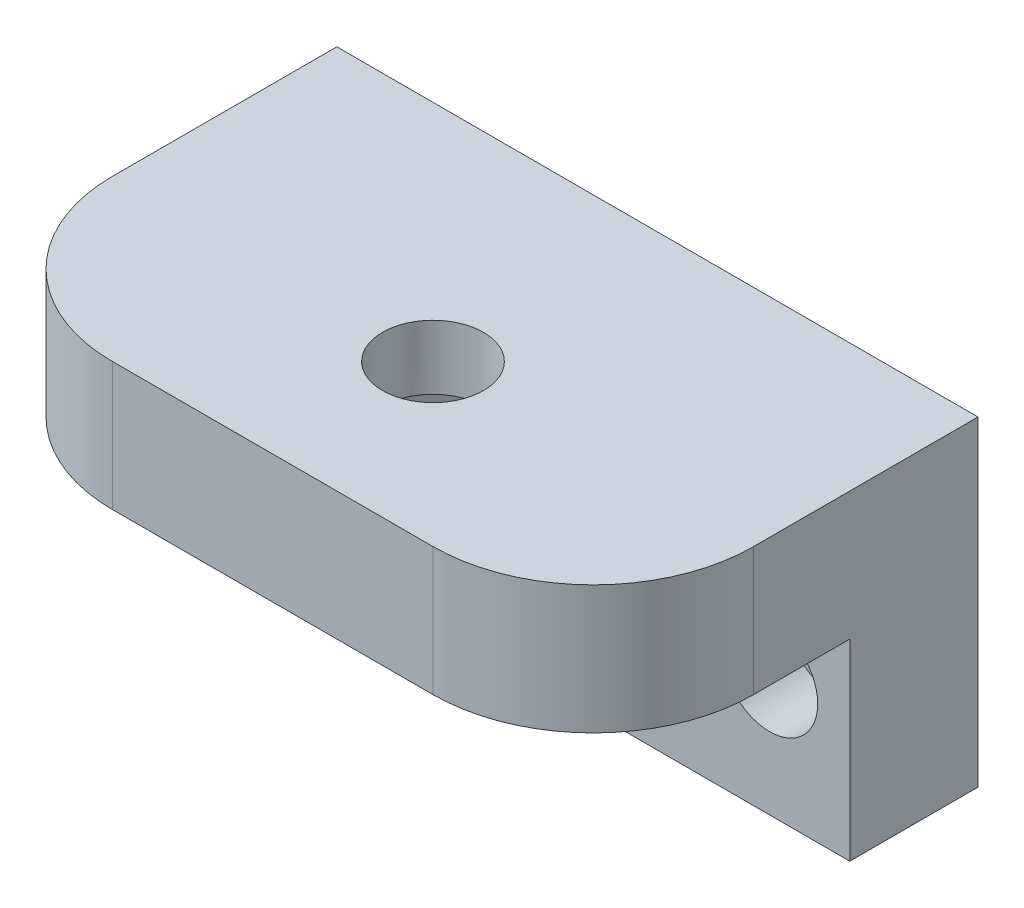
ISO-10303-21;
HEADER;
FILE_DESCRIPTION(('STEP AP214'),'2;1');
FILE_NAME('part.step','',(''),(''),'','','');
FILE_SCHEMA(('AUTOMOTIVE_DESIGN { 1 0 10303 214 1 1 1 1 }'));
ENDSEC;
DATA;
#1=APPLICATION_CONTEXT('core data for automotive mechanical design processes');
#2=APPLICATION_PROTOCOL_DEFINITION('international standard','automotive_design',2000,#1);
#3=PRODUCT_CONTEXT('',#1,'mechanical');
#4=PRODUCT('Part','Part','',(#3));
#5=PRODUCT_RELATED_PRODUCT_CATEGORY('part','',(#4));
#6=PRODUCT_DEFINITION_FORMATION('','',#4);
#7=PRODUCT_DEFINITION_CONTEXT('part definition',#1,'design');
#8=PRODUCT_DEFINITION('design','',#6,#7);
#9=PRODUCT_DEFINITION_SHAPE('','',#8);
#10=(LENGTH_UNIT() NAMED_UNIT(*) SI_UNIT(.MILLI.,.METRE.));
#11=(NAMED_UNIT(*) PLANE_ANGLE_UNIT() SI_UNIT($,.RADIAN.));
#12=(NAMED_UNIT(*) SI_UNIT($,.STERADIAN.) SOLID_ANGLE_UNIT());
#13=UNCERTAINTY_MEASURE_WITH_UNIT(LENGTH_MEASURE(1.E-05),#10,'distance_accuracy_value','');
#14=(GEOMETRIC_REPRESENTATION_CONTEXT(3) GLOBAL_UNCERTAINTY_ASSIGNED_CONTEXT((#13)) GLOBAL_UNIT_ASSIGNED_CONTEXT((#10,
#11,#12)) REPRESENTATION_CONTEXT('',''));
#15=CARTESIAN_POINT('',(0.,0.,0.));
#16=DIRECTION('',(0.,0.,1.));
#17=DIRECTION('',(1.,0.,0.));
#18=AXIS2_PLACEMENT_3D('',#15,#16,#17);
#19=CARTESIAN_POINT('',(0.,-10.,14.));
#20=DIRECTION('',(0.,1.,0.));
#21=DIRECTION('',(0.,0.,1.));
#22=AXIS2_PLACEMENT_3D('',#19,#20,#21);
#23=CYLINDRICAL_SURFACE('',#22,3.15);
#24=CARTESIAN_POINT('',(0.,10.,14.));
#25=DIRECTION('',(0.,1.,0.));
#26=DIRECTION('',(0.,0.,1.));
#27=AXIS2_PLACEMENT_3D('',#24,#25,#26);
#28=CIRCLE('',#27,3.15);
#29=CARTESIAN_POINT('',(0.,10.,17.15));
#30=VERTEX_POINT('',#29);
#31=EDGE_CURVE('E324',#30,#30,#28,.T.);
#32=ORIENTED_EDGE('',*,*,#31,.T.);
#33=EDGE_LOOP('',(#32));
#34=FACE_BOUND('',#33,.T.);
#35=CARTESIAN_POINT('',(0.,6.,14.));
#36=DIRECTION('',(0.,-1.,0.));
#37=DIRECTION('',(0.,0.,-1.));
#38=AXIS2_PLACEMENT_3D('',#35,#36,#37);
#39=CIRCLE('',#38,3.15);
#40=CARTESIAN_POINT('',(0.,6.,10.85));
#41=VERTEX_POINT('',#40);
#42=EDGE_CURVE('E242',#41,#41,#39,.F.);
#43=ORIENTED_EDGE('',*,*,#42,.F.);
#44=EDGE_LOOP('',(#43));
#45=FACE_BOUND('',#44,.T.);
#46=ADVANCED_FACE('F41',(#34,#45),#23,.F.);
#47=CARTESIAN_POINT('',(15.,-2.5,8.));
#48=DIRECTION('',(0.,0.,-1.));
#49=DIRECTION('',(-1.,0.,0.));
#50=AXIS2_PLACEMENT_3D('',#47,#48,#49);
#51=CYLINDRICAL_SURFACE('',#50,1.6);
#52=CARTESIAN_POINT('',(15.,-2.5,0.));
#53=DIRECTION('',(0.,0.,-1.));
#54=DIRECTION('',(-1.,0.,0.));
#55=AXIS2_PLACEMENT_3D('',#52,#53,#54);
#56=CIRCLE('',#55,1.6);
#57=CARTESIAN_POINT('',(13.4,-2.5,0.));
#58=VERTEX_POINT('',#57);
#59=EDGE_CURVE('E321',#58,#58,#56,.T.);
#60=ORIENTED_EDGE('',*,*,#59,.T.);
#61=EDGE_LOOP('',(#60));
#62=FACE_BOUND('',#61,.T.);
#63=CARTESIAN_POINT('',(15.,-2.5,4.));
#64=DIRECTION('',(0.,0.,1.));
#65=DIRECTION('',(1.,0.,0.));
#66=AXIS2_PLACEMENT_3D('',#63,#64,#65);
#67=CIRCLE('',#66,1.6);
#68=CARTESIAN_POINT('',(16.6,-2.5,4.));
#69=VERTEX_POINT('',#68);
#70=EDGE_CURVE('E253',#69,#69,#67,.F.);
#71=ORIENTED_EDGE('',*,*,#70,.F.);
#72=EDGE_LOOP('',(#71));
#73=FACE_BOUND('',#72,.T.);
#74=ADVANCED_FACE('F472',(#62,#73),#51,.F.);
#75=CARTESIAN_POINT('',(-15.,-2.5,8.));
#76=DIRECTION('',(0.,0.,-1.));
#77=DIRECTION('',(-1.,0.,0.));
#78=AXIS2_PLACEMENT_3D('',#75,#76,#77);
#79=CYLINDRICAL_SURFACE('',#78,1.6);
#80=CARTESIAN_POINT('',(-15.,-2.5,0.));
#81=DIRECTION('',(0.,0.,-1.));
#82=DIRECTION('',(-1.,0.,0.));
#83=AXIS2_PLACEMENT_3D('',#80,#81,#82);
#84=CIRCLE('',#83,1.6);
#85=CARTESIAN_POINT('',(-16.6,-2.5,0.));
#86=VERTEX_POINT('',#85);
#87=EDGE_CURVE('E277',#86,#86,#84,.T.);
#88=ORIENTED_EDGE('',*,*,#87,.T.);
#89=EDGE_LOOP('',(#88));
#90=FACE_BOUND('',#89,.T.);
#91=CARTESIAN_POINT('',(-15.,-2.5,4.));
#92=DIRECTION('',(0.,0.,1.));
#93=DIRECTION('',(1.,0.,0.));
#94=AXIS2_PLACEMENT_3D('',#91,#92,#93);
#95=CIRCLE('',#94,1.6);
#96=CARTESIAN_POINT('',(-13.4,-2.5,4.));
#97=VERTEX_POINT('',#96);
#98=EDGE_CURVE('E260',#97,#97,#95,.F.);
#99=ORIENTED_EDGE('',*,*,#98,.F.);
#100=EDGE_LOOP('',(#99));
#101=FACE_BOUND('',#100,.T.);
#102=ADVANCED_FACE('F478',(#90,#101),#79,.F.);
#103=CARTESIAN_POINT('',(0.,0.,0.));
#104=DIRECTION('',(0.,0.,-1.));
#105=DIRECTION('',(-1.,0.,0.));
#106=AXIS2_PLACEMENT_3D('',#103,#104,#105);
#107=PLANE('',#106);
#108=ORIENTED_EDGE('',*,*,#87,.F.);
#109=EDGE_LOOP('',(#108));
#110=FACE_BOUND('',#109,.T.);
#111=ORIENTED_EDGE('',*,*,#59,.F.);
#112=EDGE_LOOP('',(#111));
#113=FACE_BOUND('',#112,.T.);
#114=DIRECTION('',(-1.,0.,0.));
#115=VECTOR('',#114,1.);
#116=CARTESIAN_POINT('',(-7.5,2.5,0.));
#117=LINE('',#116,#115);
#118=CARTESIAN_POINT('',(-7.5,2.5,0.));
#119=VERTEX_POINT('',#118);
#120=CARTESIAN_POINT('',(-11.,2.5,0.));
#121=VERTEX_POINT('',#120);
#122=EDGE_CURVE('E264',#119,#121,#117,.T.);
#123=ORIENTED_EDGE('',*,*,#122,.T.);
#124=DIRECTION('',(0.,-1.,0.));
#125=VECTOR('',#124,1.);
#126=CARTESIAN_POINT('',(-11.,2.5,0.));
#127=LINE('',#126,#125);
#128=CARTESIAN_POINT('',(-11.,-10.,0.));
#129=VERTEX_POINT('',#128);
#130=EDGE_CURVE('E267',#121,#129,#127,.T.);
#131=ORIENTED_EDGE('',*,*,#130,.T.);
#132=DIRECTION('',(1.,0.,0.));
#133=VECTOR('',#132,1.);
#134=CARTESIAN_POINT('',(-20.,-10.,0.));
#135=LINE('',#134,#133);
#136=CARTESIAN_POINT('',(-20.,-10.,0.));
#137=VERTEX_POINT('',#136);
#138=EDGE_CURVE('E345',#137,#129,#135,.T.);
#139=ORIENTED_EDGE('',*,*,#138,.F.);
#140=DIRECTION('',(0.,-1.,0.));
#141=VECTOR('',#140,1.);
#142=CARTESIAN_POINT('',(-20.,-10.,0.));
#143=LINE('',#142,#141);
#144=CARTESIAN_POINT('',(-20.,10.,0.));
#145=VERTEX_POINT('',#144);
#146=EDGE_CURVE('E355',#145,#137,#143,.T.);
#147=ORIENTED_EDGE('',*,*,#146,.F.);
#148=DIRECTION('',(-1.,0.,0.));
#149=VECTOR('',#148,1.);
#150=CARTESIAN_POINT('',(-20.,10.,0.));
#151=LINE('',#150,#149);
#152=CARTESIAN_POINT('',(20.,10.,0.));
#153=VERTEX_POINT('',#152);
#154=EDGE_CURVE('E352',#153,#145,#151,.T.);
#155=ORIENTED_EDGE('',*,*,#154,.F.);
#156=DIRECTION('',(0.,1.,0.));
#157=VECTOR('',#156,1.);
#158=CARTESIAN_POINT('',(20.,-10.,0.));
#159=LINE('',#158,#157);
#160=CARTESIAN_POINT('',(20.,-10.,0.));
#161=VERTEX_POINT('',#160);
#162=EDGE_CURVE('E340',#161,#153,#159,.T.);
#163=ORIENTED_EDGE('',*,*,#162,.F.);
#164=CARTESIAN_POINT('',(11.,-10.,0.));
#165=VERTEX_POINT('',#164);
#166=EDGE_CURVE('E357',#165,#161,#135,.T.);
#167=ORIENTED_EDGE('',*,*,#166,.F.);
#168=DIRECTION('',(0.,1.,0.));
#169=VECTOR('',#168,1.);
#170=CARTESIAN_POINT('',(11.,-10.,0.));
#171=LINE('',#170,#169);
#172=CARTESIAN_POINT('',(11.,2.5,0.));
#173=VERTEX_POINT('',#172);
#174=EDGE_CURVE('E275',#165,#173,#171,.T.);
#175=ORIENTED_EDGE('',*,*,#174,.T.);
#176=DIRECTION('',(-1.,0.,0.));
#177=VECTOR('',#176,1.);
#178=CARTESIAN_POINT('',(11.,2.5,0.));
#179=LINE('',#178,#177);
#180=CARTESIAN_POINT('',(7.5,2.5,0.));
#181=VERTEX_POINT('',#180);
#182=EDGE_CURVE('E273',#173,#181,#179,.T.);
#183=ORIENTED_EDGE('',*,*,#182,.T.);
#184=DIRECTION('',(0.,1.,0.));
#185=VECTOR('',#184,1.);
#186=CARTESIAN_POINT('',(7.5,2.5,0.));
#187=LINE('',#186,#185);
#188=CARTESIAN_POINT('',(7.5,6.5,0.));
#189=VERTEX_POINT('',#188);
#190=EDGE_CURVE('E271',#181,#189,#187,.T.);
#191=ORIENTED_EDGE('',*,*,#190,.T.);
#192=DIRECTION('',(-1.,0.,0.));
#193=VECTOR('',#192,1.);
#194=CARTESIAN_POINT('',(7.5,6.5,0.));
#195=LINE('',#194,#193);
#196=CARTESIAN_POINT('',(-7.5,6.5,0.));
#197=VERTEX_POINT('',#196);
#198=EDGE_CURVE('E269',#189,#197,#195,.T.);
#199=ORIENTED_EDGE('',*,*,#198,.T.);
#200=DIRECTION('',(0.,-1.,0.));
#201=VECTOR('',#200,1.);
#202=CARTESIAN_POINT('',(-7.5,6.5,0.));
#203=LINE('',#202,#201);
#204=EDGE_CURVE('E266',#197,#119,#203,.T.);
#205=ORIENTED_EDGE('',*,*,#204,.T.);
#206=EDGE_LOOP('',(#123,#131,#139,#147,#155,#163,#167,#175,#183,#191,#199,#205));
#207=FACE_BOUND('',#206,.T.);
#208=ADVANCED_FACE('F404',(#110,#113,#207),#107,.T.);
#209=CARTESIAN_POINT('',(0.,0.,8.));
#210=DIRECTION('',(0.,0.,-1.));
#211=DIRECTION('',(-1.,0.,0.));
#212=AXIS2_PLACEMENT_3D('',#209,#210,#211);
#213=PLANE('',#212);
#214=CARTESIAN_POINT('',(15.,-2.5,8.));
#215=DIRECTION('',(0.,0.,1.));
#216=DIRECTION('',(1.,0.,0.));
#217=AXIS2_PLACEMENT_3D('',#214,#215,#216);
#218=CIRCLE('',#217,3.);
#219=CARTESIAN_POINT('',(18.,-2.5,8.));
#220=VERTEX_POINT('',#219);
#221=EDGE_CURVE('E254',#220,#220,#218,.T.);
#222=ORIENTED_EDGE('',*,*,#221,.F.);
#223=EDGE_LOOP('',(#222));
#224=FACE_BOUND('',#223,.T.);
#225=CARTESIAN_POINT('',(-15.,-2.5,8.));
#226=DIRECTION('',(0.,0.,1.));
#227=DIRECTION('',(1.,0.,0.));
#228=AXIS2_PLACEMENT_3D('',#225,#226,#227);
#229=CIRCLE('',#228,3.);
#230=CARTESIAN_POINT('',(-12.,-2.5,8.));
#231=VERTEX_POINT('',#230);
#232=EDGE_CURVE('E261',#231,#231,#229,.T.);
#233=ORIENTED_EDGE('',*,*,#232,.F.);
#234=EDGE_LOOP('',(#233));
#235=FACE_BOUND('',#234,.T.);
#236=DIRECTION('',(1.,0.,0.));
#237=VECTOR('',#236,1.);
#238=CARTESIAN_POINT('',(-20.,2.,8.));
#239=LINE('',#238,#237);
#240=CARTESIAN_POINT('',(-20.,2.,8.));
#241=VERTEX_POINT('',#240);
#242=CARTESIAN_POINT('',(20.,2.,8.));
#243=VERTEX_POINT('',#242);
#244=EDGE_CURVE('E327',#241,#243,#239,.T.);
#245=ORIENTED_EDGE('',*,*,#244,.F.);
#246=DIRECTION('',(0.,-1.,0.));
#247=VECTOR('',#246,1.);
#248=CARTESIAN_POINT('',(-20.,-10.,8.));
#249=LINE('',#248,#247);
#250=CARTESIAN_POINT('',(-20.,-10.,8.));
#251=VERTEX_POINT('',#250);
#252=EDGE_CURVE('E344',#241,#251,#249,.T.);
#253=ORIENTED_EDGE('',*,*,#252,.T.);
#254=DIRECTION('',(1.,0.,0.));
#255=VECTOR('',#254,1.);
#256=CARTESIAN_POINT('',(-20.,-10.,8.));
#257=LINE('',#256,#255);
#258=CARTESIAN_POINT('',(20.,-10.,8.));
#259=VERTEX_POINT('',#258);
#260=EDGE_CURVE('E347',#251,#259,#257,.T.);
#261=ORIENTED_EDGE('',*,*,#260,.T.);
#262=DIRECTION('',(0.,1.,0.));
#263=VECTOR('',#262,1.);
#264=CARTESIAN_POINT('',(20.,-10.,8.));
#265=LINE('',#264,#263);
#266=EDGE_CURVE('E341',#259,#243,#265,.T.);
#267=ORIENTED_EDGE('',*,*,#266,.T.);
#268=EDGE_LOOP('',(#245,#253,#261,#267));
#269=FACE_BOUND('',#268,.T.);
#270=ADVANCED_FACE('F418',(#224,#235,#269),#213,.F.);
#271=CARTESIAN_POINT('',(20.,-10.,8.));
#272=DIRECTION('',(-1.,0.,0.));
#273=DIRECTION('',(0.,0.,1.));
#274=AXIS2_PLACEMENT_3D('',#271,#272,#273);
#275=PLANE('',#274);
#276=DIRECTION('',(0.,0.,-1.));
#277=VECTOR('',#276,1.);
#278=CARTESIAN_POINT('',(20.,10.,8.));
#279=LINE('',#278,#277);
#280=CARTESIAN_POINT('',(20.,10.,14.));
#281=VERTEX_POINT('',#280);
#282=EDGE_CURVE('E367',#281,#153,#279,.T.);
#283=ORIENTED_EDGE('',*,*,#282,.F.);
#284=DIRECTION('',(0.,1.,0.));
#285=VECTOR('',#284,1.);
#286=CARTESIAN_POINT('',(20.,2.,14.));
#287=LINE('',#286,#285);
#288=CARTESIAN_POINT('',(20.,2.,14.));
#289=VERTEX_POINT('',#288);
#290=EDGE_CURVE('E64',#281,#289,#287,.F.);
#291=ORIENTED_EDGE('',*,*,#290,.T.);
#292=DIRECTION('',(0.,0.,-1.));
#293=VECTOR('',#292,1.);
#294=CARTESIAN_POINT('',(20.,2.,24.));
#295=LINE('',#294,#293);
#296=EDGE_CURVE('E334',#289,#243,#295,.T.);
#297=ORIENTED_EDGE('',*,*,#296,.T.);
#298=ORIENTED_EDGE('',*,*,#266,.F.);
#299=DIRECTION('',(0.,0.,-1.));
#300=VECTOR('',#299,1.);
#301=CARTESIAN_POINT('',(20.,-10.,8.));
#302=LINE('',#301,#300);
#303=EDGE_CURVE('E349',#259,#161,#302,.T.);
#304=ORIENTED_EDGE('',*,*,#303,.T.);
#305=ORIENTED_EDGE('',*,*,#162,.T.);
#306=EDGE_LOOP('',(#283,#291,#297,#298,#304,#305));
#307=FACE_BOUND('',#306,.T.);
#308=ADVANCED_FACE('F398',(#307),#275,.F.);
#309=CARTESIAN_POINT('',(-20.,10.,8.));
#310=DIRECTION('',(0.,-1.,0.));
#311=DIRECTION('',(0.,0.,-1.));
#312=AXIS2_PLACEMENT_3D('',#309,#310,#311);
#313=PLANE('',#312);
#314=ORIENTED_EDGE('',*,*,#31,.F.);
#315=EDGE_LOOP('',(#314));
#316=FACE_BOUND('',#315,.T.);
#317=DIRECTION('',(-1.,0.,0.));
#318=VECTOR('',#317,1.);
#319=CARTESIAN_POINT('',(-20.,10.,24.));
#320=LINE('',#319,#318);
#321=CARTESIAN_POINT('',(9.99999999999999,10.,24.));
#322=VERTEX_POINT('',#321);
#323=CARTESIAN_POINT('',(-10.,10.,24.));
#324=VERTEX_POINT('',#323);
#325=EDGE_CURVE('E331',#322,#324,#320,.T.);
#326=ORIENTED_EDGE('',*,*,#325,.F.);
#327=CARTESIAN_POINT('',(9.99999999999999,10.,14.));
#328=DIRECTION('',(0.,-1.,0.));
#329=DIRECTION('',(0.,0.,-1.));
#330=AXIS2_PLACEMENT_3D('',#327,#328,#329);
#331=CIRCLE('',#330,10.);
#332=EDGE_CURVE('E383',#322,#281,#331,.F.);
#333=ORIENTED_EDGE('',*,*,#332,.T.);
#334=ORIENTED_EDGE('',*,*,#282,.T.);
#335=ORIENTED_EDGE('',*,*,#154,.T.);
#336=DIRECTION('',(0.,0.,-1.));
#337=VECTOR('',#336,1.);
#338=CARTESIAN_POINT('',(-20.,10.,8.));
#339=LINE('',#338,#337);
#340=CARTESIAN_POINT('',(-20.,10.,14.));
#341=VERTEX_POINT('',#340);
#342=EDGE_CURVE('E365',#341,#145,#339,.T.);
#343=ORIENTED_EDGE('',*,*,#342,.F.);
#344=CARTESIAN_POINT('',(-10.,10.,14.));
#345=DIRECTION('',(0.,-1.,0.));
#346=DIRECTION('',(0.,0.,-1.));
#347=AXIS2_PLACEMENT_3D('',#344,#345,#346);
#348=CIRCLE('',#347,10.);
#349=EDGE_CURVE('E381',#341,#324,#348,.F.);
#350=ORIENTED_EDGE('',*,*,#349,.T.);
#351=EDGE_LOOP('',(#326,#333,#334,#335,#343,#350));
#352=FACE_BOUND('',#351,.T.);
#353=ADVANCED_FACE('F396',(#316,#352),#313,.F.);
#354=CARTESIAN_POINT('',(-20.,-10.,8.));
#355=DIRECTION('',(1.,0.,0.));
#356=DIRECTION('',(0.,0.,-1.));
#357=AXIS2_PLACEMENT_3D('',#354,#355,#356);
#358=PLANE('',#357);
#359=DIRECTION('',(0.,0.,-1.));
#360=VECTOR('',#359,1.);
#361=CARTESIAN_POINT('',(-20.,2.,24.));
#362=LINE('',#361,#360);
#363=CARTESIAN_POINT('',(-20.,2.,14.));
#364=VERTEX_POINT('',#363);
#365=EDGE_CURVE('E338',#364,#241,#362,.T.);
#366=ORIENTED_EDGE('',*,*,#365,.F.);
#367=DIRECTION('',(0.,-1.,0.));
#368=VECTOR('',#367,1.);
#369=CARTESIAN_POINT('',(-20.,10.,14.));
#370=LINE('',#369,#368);
#371=EDGE_CURVE('E11',#364,#341,#370,.F.);
#372=ORIENTED_EDGE('',*,*,#371,.T.);
#373=ORIENTED_EDGE('',*,*,#342,.T.);
#374=ORIENTED_EDGE('',*,*,#146,.T.);
#375=DIRECTION('',(0.,0.,-1.));
#376=VECTOR('',#375,1.);
#377=CARTESIAN_POINT('',(-20.,-10.,8.));
#378=LINE('',#377,#376);
#379=EDGE_CURVE('E362',#251,#137,#378,.T.);
#380=ORIENTED_EDGE('',*,*,#379,.F.);
#381=ORIENTED_EDGE('',*,*,#252,.F.);
#382=EDGE_LOOP('',(#366,#372,#373,#374,#380,#381));
#383=FACE_BOUND('',#382,.T.);
#384=ADVANCED_FACE('F413',(#383),#358,.F.);
#385=CARTESIAN_POINT('',(-20.,-10.,8.));
#386=DIRECTION('',(0.,1.,0.));
#387=DIRECTION('',(0.,0.,1.));
#388=AXIS2_PLACEMENT_3D('',#385,#386,#387);
#389=PLANE('',#388);
#390=ORIENTED_EDGE('',*,*,#138,.T.);
#391=DIRECTION('',(0.,0.,1.));
#392=VECTOR('',#391,1.);
#393=CARTESIAN_POINT('',(-11.,-10.,-73.4428877022476));
#394=LINE('',#393,#392);
#395=CARTESIAN_POINT('',(-11.,-10.,1.6));
#396=VERTEX_POINT('',#395);
#397=EDGE_CURVE('E312',#129,#396,#394,.T.);
#398=ORIENTED_EDGE('',*,*,#397,.T.);
#399=DIRECTION('',(1.,0.,0.));
#400=VECTOR('',#399,1.);
#401=CARTESIAN_POINT('',(-20.,-10.,1.6));
#402=LINE('',#401,#400);
#403=CARTESIAN_POINT('',(11.,-10.,1.6));
#404=VERTEX_POINT('',#403);
#405=EDGE_CURVE('E281',#396,#404,#402,.T.);
#406=ORIENTED_EDGE('',*,*,#405,.T.);
#407=DIRECTION('',(0.,0.,1.));
#408=VECTOR('',#407,1.);
#409=CARTESIAN_POINT('',(11.,-10.,-73.4428877022476));
#410=LINE('',#409,#408);
#411=EDGE_CURVE('E294',#165,#404,#410,.T.);
#412=ORIENTED_EDGE('',*,*,#411,.F.);
#413=ORIENTED_EDGE('',*,*,#166,.T.);
#414=ORIENTED_EDGE('',*,*,#303,.F.);
#415=ORIENTED_EDGE('',*,*,#260,.F.);
#416=ORIENTED_EDGE('',*,*,#379,.T.);
#417=EDGE_LOOP('',(#390,#398,#406,#412,#413,#414,#415,#416));
#418=FACE_BOUND('',#417,.T.);
#419=ADVANCED_FACE('F421',(#418),#389,.F.);
#420=CARTESIAN_POINT('',(-20.,2.,24.));
#421=DIRECTION('',(0.,1.,0.));
#422=DIRECTION('',(0.,0.,1.));
#423=AXIS2_PLACEMENT_3D('',#420,#421,#422);
#424=PLANE('',#423);
#425=DIRECTION('',(-0.5,0.,0.866025403784439));
#426=VECTOR('',#425,1.);
#427=CARTESIAN_POINT('',(6.06217782649107,2.,14.));
#428=LINE('',#427,#426);
#429=CARTESIAN_POINT('',(6.06217782649107,2.,14.));
#430=VERTEX_POINT('',#429);
#431=CARTESIAN_POINT('',(3.03108891324553,2.,19.25));
#432=VERTEX_POINT('',#431);
#433=EDGE_CURVE('E230',#430,#432,#428,.T.);
#434=ORIENTED_EDGE('',*,*,#433,.F.);
#435=DIRECTION('',(0.5,0.,0.866025403784438));
#436=VECTOR('',#435,1.);
#437=CARTESIAN_POINT('',(3.03108891324553,2.,8.75));
#438=LINE('',#437,#436);
#439=CARTESIAN_POINT('',(3.03108891324553,2.,8.75));
#440=VERTEX_POINT('',#439);
#441=EDGE_CURVE('E197',#440,#430,#438,.T.);
#442=ORIENTED_EDGE('',*,*,#441,.F.);
#443=DIRECTION('',(1.,0.,0.));
#444=VECTOR('',#443,1.);
#445=CARTESIAN_POINT('',(-3.03108891324553,2.,8.75));
#446=LINE('',#445,#444);
#447=CARTESIAN_POINT('',(-3.03108891324553,2.,8.75));
#448=VERTEX_POINT('',#447);
#449=EDGE_CURVE('E216',#448,#440,#446,.T.);
#450=ORIENTED_EDGE('',*,*,#449,.F.);
#451=DIRECTION('',(0.5,0.,-0.866025403784439));
#452=VECTOR('',#451,1.);
#453=CARTESIAN_POINT('',(-6.06217782649107,2.,14.));
#454=LINE('',#453,#452);
#455=CARTESIAN_POINT('',(-6.06217782649107,2.,14.));
#456=VERTEX_POINT('',#455);
#457=EDGE_CURVE('E219',#456,#448,#454,.T.);
#458=ORIENTED_EDGE('',*,*,#457,.F.);
#459=DIRECTION('',(-0.5,0.,-0.866025403784439));
#460=VECTOR('',#459,1.);
#461=CARTESIAN_POINT('',(-3.03108891324553,2.,19.25));
#462=LINE('',#461,#460);
#463=CARTESIAN_POINT('',(-3.03108891324553,2.,19.25));
#464=VERTEX_POINT('',#463);
#465=EDGE_CURVE('E235',#464,#456,#462,.T.);
#466=ORIENTED_EDGE('',*,*,#465,.F.);
#467=DIRECTION('',(-1.,0.,0.));
#468=VECTOR('',#467,1.);
#469=CARTESIAN_POINT('',(3.03108891324553,2.,19.25));
#470=LINE('',#469,#468);
#471=EDGE_CURVE('E232',#432,#464,#470,.T.);
#472=ORIENTED_EDGE('',*,*,#471,.F.);
#473=EDGE_LOOP('',(#434,#442,#450,#458,#466,#472));
#474=FACE_BOUND('',#473,.T.);
#475=ORIENTED_EDGE('',*,*,#296,.F.);
#476=CARTESIAN_POINT('',(9.99999999999999,2.,14.));
#477=DIRECTION('',(0.,1.,0.));
#478=DIRECTION('',(0.,0.,1.));
#479=AXIS2_PLACEMENT_3D('',#476,#477,#478);
#480=CIRCLE('',#479,10.);
#481=CARTESIAN_POINT('',(9.99999999999999,2.,24.));
#482=VERTEX_POINT('',#481);
#483=EDGE_CURVE('E49',#289,#482,#480,.F.);
#484=ORIENTED_EDGE('',*,*,#483,.T.);
#485=DIRECTION('',(1.,0.,0.));
#486=VECTOR('',#485,1.);
#487=CARTESIAN_POINT('',(-20.,2.,24.));
#488=LINE('',#487,#486);
#489=CARTESIAN_POINT('',(-10.,2.,24.));
#490=VERTEX_POINT('',#489);
#491=EDGE_CURVE('E328',#490,#482,#488,.T.);
#492=ORIENTED_EDGE('',*,*,#491,.F.);
#493=CARTESIAN_POINT('',(-10.,2.,14.));
#494=DIRECTION('',(0.,1.,0.));
#495=DIRECTION('',(0.,0.,1.));
#496=AXIS2_PLACEMENT_3D('',#493,#494,#495);
#497=CIRCLE('',#496,10.);
#498=EDGE_CURVE('E56',#490,#364,#497,.F.);
#499=ORIENTED_EDGE('',*,*,#498,.T.);
#500=ORIENTED_EDGE('',*,*,#365,.T.);
#501=ORIENTED_EDGE('',*,*,#244,.T.);
#502=EDGE_LOOP('',(#475,#484,#492,#499,#500,#501));
#503=FACE_BOUND('',#502,.T.);
#504=ADVANCED_FACE('F387',(#474,#503),#424,.F.);
#505=CARTESIAN_POINT('',(0.,0.,24.));
#506=DIRECTION('',(0.,0.,1.));
#507=DIRECTION('',(1.,0.,0.));
#508=AXIS2_PLACEMENT_3D('',#505,#506,#507);
#509=PLANE('',#508);
#510=ORIENTED_EDGE('',*,*,#491,.T.);
#511=DIRECTION('',(0.,1.,0.));
#512=VECTOR('',#511,1.);
#513=CARTESIAN_POINT('',(9.99999999999999,10.,24.));
#514=LINE('',#513,#512);
#515=EDGE_CURVE('E378',#482,#322,#514,.T.);
#516=ORIENTED_EDGE('',*,*,#515,.T.);
#517=ORIENTED_EDGE('',*,*,#325,.T.);
#518=DIRECTION('',(0.,-1.,0.));
#519=VECTOR('',#518,1.);
#520=CARTESIAN_POINT('',(-10.,2.,24.));
#521=LINE('',#520,#519);
#522=EDGE_CURVE('E369',#324,#490,#521,.T.);
#523=ORIENTED_EDGE('',*,*,#522,.T.);
#524=EDGE_LOOP('',(#510,#516,#517,#523));
#525=FACE_BOUND('',#524,.T.);
#526=ADVANCED_FACE('F391',(#525),#509,.T.);
#527=CARTESIAN_POINT('',(-11.,2.5,-73.4428877022476));
#528=DIRECTION('',(-1.,0.,0.));
#529=DIRECTION('',(0.,-1.,0.));
#530=AXIS2_PLACEMENT_3D('',#527,#528,#529);
#531=PLANE('',#530);
#532=DIRECTION('',(0.,0.,1.));
#533=VECTOR('',#532,1.);
#534=CARTESIAN_POINT('',(-11.,2.5,-73.4428877022476));
#535=LINE('',#534,#533);
#536=CARTESIAN_POINT('',(-11.,2.5,1.6));
#537=VERTEX_POINT('',#536);
#538=EDGE_CURVE('E314',#121,#537,#535,.T.);
#539=ORIENTED_EDGE('',*,*,#538,.T.);
#540=DIRECTION('',(0.,-1.,0.));
#541=VECTOR('',#540,1.);
#542=CARTESIAN_POINT('',(-11.,2.5,1.6));
#543=LINE('',#542,#541);
#544=EDGE_CURVE('E291',#537,#396,#543,.T.);
#545=ORIENTED_EDGE('',*,*,#544,.T.);
#546=ORIENTED_EDGE('',*,*,#397,.F.);
#547=ORIENTED_EDGE('',*,*,#130,.F.);
#548=EDGE_LOOP('',(#539,#545,#546,#547));
#549=FACE_BOUND('',#548,.T.);
#550=ADVANCED_FACE('F455',(#549),#531,.F.);
#551=CARTESIAN_POINT('',(-7.5,2.5,-73.4428877022476));
#552=DIRECTION('',(0.,1.,0.));
#553=DIRECTION('',(0.,0.,1.));
#554=AXIS2_PLACEMENT_3D('',#551,#552,#553);
#555=PLANE('',#554);
#556=DIRECTION('',(0.,0.,1.));
#557=VECTOR('',#556,1.);
#558=CARTESIAN_POINT('',(-7.5,2.5,-73.4428877022476));
#559=LINE('',#558,#557);
#560=CARTESIAN_POINT('',(-7.5,2.5,1.6));
#561=VERTEX_POINT('',#560);
#562=EDGE_CURVE('E309',#119,#561,#559,.T.);
#563=ORIENTED_EDGE('',*,*,#562,.T.);
#564=DIRECTION('',(-1.,0.,0.));
#565=VECTOR('',#564,1.);
#566=CARTESIAN_POINT('',(-7.5,2.5,1.6));
#567=LINE('',#566,#565);
#568=EDGE_CURVE('E289',#561,#537,#567,.T.);
#569=ORIENTED_EDGE('',*,*,#568,.T.);
#570=ORIENTED_EDGE('',*,*,#538,.F.);
#571=ORIENTED_EDGE('',*,*,#122,.F.);
#572=EDGE_LOOP('',(#563,#569,#570,#571));
#573=FACE_BOUND('',#572,.T.);
#574=ADVANCED_FACE('F452',(#573),#555,.F.);
#575=CARTESIAN_POINT('',(-7.5,6.5,-73.4428877022476));
#576=DIRECTION('',(-1.,0.,0.));
#577=DIRECTION('',(0.,-1.,0.));
#578=AXIS2_PLACEMENT_3D('',#575,#576,#577);
#579=PLANE('',#578);
#580=DIRECTION('',(0.,0.,1.));
#581=VECTOR('',#580,1.);
#582=CARTESIAN_POINT('',(-7.5,6.5,-73.4428877022476));
#583=LINE('',#582,#581);
#584=CARTESIAN_POINT('',(-7.5,6.5,1.6));
#585=VERTEX_POINT('',#584);
#586=EDGE_CURVE('E306',#197,#585,#583,.T.);
#587=ORIENTED_EDGE('',*,*,#586,.T.);
#588=DIRECTION('',(0.,-1.,0.));
#589=VECTOR('',#588,1.);
#590=CARTESIAN_POINT('',(-7.5,6.5,1.6));
#591=LINE('',#590,#589);
#592=EDGE_CURVE('E287',#585,#561,#591,.T.);
#593=ORIENTED_EDGE('',*,*,#592,.T.);
#594=ORIENTED_EDGE('',*,*,#562,.F.);
#595=ORIENTED_EDGE('',*,*,#204,.F.);
#596=EDGE_LOOP('',(#587,#593,#594,#595));
#597=FACE_BOUND('',#596,.T.);
#598=ADVANCED_FACE('F445',(#597),#579,.F.);
#599=CARTESIAN_POINT('',(7.5,6.5,-73.4428877022476));
#600=DIRECTION('',(0.,1.,0.));
#601=DIRECTION('',(0.,0.,1.));
#602=AXIS2_PLACEMENT_3D('',#599,#600,#601);
#603=PLANE('',#602);
#604=DIRECTION('',(0.,0.,1.));
#605=VECTOR('',#604,1.);
#606=CARTESIAN_POINT('',(7.5,6.5,-73.4428877022476));
#607=LINE('',#606,#605);
#608=CARTESIAN_POINT('',(7.5,6.5,1.6));
#609=VERTEX_POINT('',#608);
#610=EDGE_CURVE('E303',#189,#609,#607,.T.);
#611=ORIENTED_EDGE('',*,*,#610,.T.);
#612=DIRECTION('',(-1.,0.,0.));
#613=VECTOR('',#612,1.);
#614=CARTESIAN_POINT('',(7.5,6.5,1.6));
#615=LINE('',#614,#613);
#616=EDGE_CURVE('E285',#609,#585,#615,.T.);
#617=ORIENTED_EDGE('',*,*,#616,.T.);
#618=ORIENTED_EDGE('',*,*,#586,.F.);
#619=ORIENTED_EDGE('',*,*,#198,.F.);
#620=EDGE_LOOP('',(#611,#617,#618,#619));
#621=FACE_BOUND('',#620,.T.);
#622=ADVANCED_FACE('F442',(#621),#603,.F.);
#623=CARTESIAN_POINT('',(7.5,2.5,-73.4428877022476));
#624=DIRECTION('',(1.,0.,0.));
#625=DIRECTION('',(0.,0.,-1.));
#626=AXIS2_PLACEMENT_3D('',#623,#624,#625);
#627=PLANE('',#626);
#628=DIRECTION('',(0.,0.,1.));
#629=VECTOR('',#628,1.);
#630=CARTESIAN_POINT('',(7.5,2.5,-73.4428877022476));
#631=LINE('',#630,#629);
#632=CARTESIAN_POINT('',(7.5,2.5,1.6));
#633=VERTEX_POINT('',#632);
#634=EDGE_CURVE('E300',#181,#633,#631,.T.);
#635=ORIENTED_EDGE('',*,*,#634,.T.);
#636=DIRECTION('',(0.,1.,0.));
#637=VECTOR('',#636,1.);
#638=CARTESIAN_POINT('',(7.5,2.5,1.6));
#639=LINE('',#638,#637);
#640=EDGE_CURVE('E283',#633,#609,#639,.T.);
#641=ORIENTED_EDGE('',*,*,#640,.T.);
#642=ORIENTED_EDGE('',*,*,#610,.F.);
#643=ORIENTED_EDGE('',*,*,#190,.F.);
#644=EDGE_LOOP('',(#635,#641,#642,#643));
#645=FACE_BOUND('',#644,.T.);
#646=ADVANCED_FACE('F435',(#645),#627,.F.);
#647=CARTESIAN_POINT('',(11.,2.5,-73.4428877022476));
#648=DIRECTION('',(0.,1.,0.));
#649=DIRECTION('',(0.,0.,1.));
#650=AXIS2_PLACEMENT_3D('',#647,#648,#649);
#651=PLANE('',#650);
#652=DIRECTION('',(0.,0.,1.));
#653=VECTOR('',#652,1.);
#654=CARTESIAN_POINT('',(11.,2.5,-73.4428877022476));
#655=LINE('',#654,#653);
#656=CARTESIAN_POINT('',(11.,2.5,1.6));
#657=VERTEX_POINT('',#656);
#658=EDGE_CURVE('E297',#173,#657,#655,.T.);
#659=ORIENTED_EDGE('',*,*,#658,.T.);
#660=DIRECTION('',(-1.,0.,0.));
#661=VECTOR('',#660,1.);
#662=CARTESIAN_POINT('',(11.,2.5,1.6));
#663=LINE('',#662,#661);
#664=EDGE_CURVE('E280',#657,#633,#663,.T.);
#665=ORIENTED_EDGE('',*,*,#664,.T.);
#666=ORIENTED_EDGE('',*,*,#634,.F.);
#667=ORIENTED_EDGE('',*,*,#182,.F.);
#668=EDGE_LOOP('',(#659,#665,#666,#667));
#669=FACE_BOUND('',#668,.T.);
#670=ADVANCED_FACE('F432',(#669),#651,.F.);
#671=CARTESIAN_POINT('',(11.,-10.,-73.4428877022476));
#672=DIRECTION('',(1.,0.,0.));
#673=DIRECTION('',(0.,0.,-1.));
#674=AXIS2_PLACEMENT_3D('',#671,#672,#673);
#675=PLANE('',#674);
#676=ORIENTED_EDGE('',*,*,#411,.T.);
#677=DIRECTION('',(0.,1.,0.));
#678=VECTOR('',#677,1.);
#679=CARTESIAN_POINT('',(11.,-10.,1.6));
#680=LINE('',#679,#678);
#681=EDGE_CURVE('E278',#404,#657,#680,.T.);
#682=ORIENTED_EDGE('',*,*,#681,.T.);
#683=ORIENTED_EDGE('',*,*,#658,.F.);
#684=ORIENTED_EDGE('',*,*,#174,.F.);
#685=EDGE_LOOP('',(#676,#682,#683,#684));
#686=FACE_BOUND('',#685,.T.);
#687=ADVANCED_FACE('F425',(#686),#675,.F.);
#688=CARTESIAN_POINT('',(0.,0.,1.6));
#689=DIRECTION('',(0.,0.,-1.));
#690=DIRECTION('',(-1.,0.,0.));
#691=AXIS2_PLACEMENT_3D('',#688,#689,#690);
#692=PLANE('',#691);
#693=ORIENTED_EDGE('',*,*,#664,.F.);
#694=ORIENTED_EDGE('',*,*,#681,.F.);
#695=ORIENTED_EDGE('',*,*,#405,.F.);
#696=ORIENTED_EDGE('',*,*,#544,.F.);
#697=ORIENTED_EDGE('',*,*,#568,.F.);
#698=ORIENTED_EDGE('',*,*,#592,.F.);
#699=ORIENTED_EDGE('',*,*,#616,.F.);
#700=ORIENTED_EDGE('',*,*,#640,.F.);
#701=EDGE_LOOP('',(#693,#694,#695,#696,#697,#698,#699,#700));
#702=FACE_BOUND('',#701,.T.);
#703=ADVANCED_FACE('F458',(#702),#692,.T.);
#704=CARTESIAN_POINT('',(-15.,-2.5,4.));
#705=DIRECTION('',(0.,0.,1.));
#706=DIRECTION('',(1.,0.,0.));
#707=AXIS2_PLACEMENT_3D('',#704,#705,#706);
#708=PLANE('',#707);
#709=CARTESIAN_POINT('',(-15.,-2.5,4.));
#710=DIRECTION('',(0.,0.,1.));
#711=DIRECTION('',(1.,0.,0.));
#712=AXIS2_PLACEMENT_3D('',#709,#710,#711);
#713=CIRCLE('',#712,3.);
#714=CARTESIAN_POINT('',(-12.,-2.5,4.));
#715=VERTEX_POINT('',#714);
#716=EDGE_CURVE('E257',#715,#715,#713,.T.);
#717=ORIENTED_EDGE('',*,*,#716,.T.);
#718=EDGE_LOOP('',(#717));
#719=FACE_BOUND('',#718,.T.);
#720=ORIENTED_EDGE('',*,*,#98,.T.);
#721=EDGE_LOOP('',(#720));
#722=FACE_BOUND('',#721,.T.);
#723=ADVANCED_FACE('F460',(#719,#722),#708,.T.);
#724=CARTESIAN_POINT('',(-15.,-2.5,4.));
#725=DIRECTION('',(0.,0.,1.));
#726=DIRECTION('',(1.,0.,0.));
#727=AXIS2_PLACEMENT_3D('',#724,#725,#726);
#728=CYLINDRICAL_SURFACE('',#727,3.);
#729=ORIENTED_EDGE('',*,*,#716,.F.);
#730=EDGE_LOOP('',(#729));
#731=FACE_BOUND('',#730,.T.);
#732=ORIENTED_EDGE('',*,*,#232,.T.);
#733=EDGE_LOOP('',(#732));
#734=FACE_BOUND('',#733,.T.);
#735=ADVANCED_FACE('F466',(#731,#734),#728,.F.);
#736=CARTESIAN_POINT('',(15.,-2.5,4.));
#737=DIRECTION('',(0.,0.,1.));
#738=DIRECTION('',(1.,0.,0.));
#739=AXIS2_PLACEMENT_3D('',#736,#737,#738);
#740=PLANE('',#739);
#741=CARTESIAN_POINT('',(15.,-2.5,4.));
#742=DIRECTION('',(0.,0.,1.));
#743=DIRECTION('',(1.,0.,0.));
#744=AXIS2_PLACEMENT_3D('',#741,#742,#743);
#745=CIRCLE('',#744,3.);
#746=CARTESIAN_POINT('',(18.,-2.5,4.));
#747=VERTEX_POINT('',#746);
#748=EDGE_CURVE('E250',#747,#747,#745,.T.);
#749=ORIENTED_EDGE('',*,*,#748,.T.);
#750=EDGE_LOOP('',(#749));
#751=FACE_BOUND('',#750,.T.);
#752=ORIENTED_EDGE('',*,*,#70,.T.);
#753=EDGE_LOOP('',(#752));
#754=FACE_BOUND('',#753,.T.);
#755=ADVANCED_FACE('F520',(#751,#754),#740,.T.);
#756=CARTESIAN_POINT('',(15.,-2.5,4.));
#757=DIRECTION('',(0.,0.,1.));
#758=DIRECTION('',(1.,0.,0.));
#759=AXIS2_PLACEMENT_3D('',#756,#757,#758);
#760=CYLINDRICAL_SURFACE('',#759,3.);
#761=ORIENTED_EDGE('',*,*,#748,.F.);
#762=EDGE_LOOP('',(#761));
#763=FACE_BOUND('',#762,.T.);
#764=ORIENTED_EDGE('',*,*,#221,.T.);
#765=EDGE_LOOP('',(#764));
#766=FACE_BOUND('',#765,.T.);
#767=ADVANCED_FACE('F523',(#763,#766),#760,.F.);
#768=CARTESIAN_POINT('',(0.,6.,0.));
#769=DIRECTION('',(0.,-1.,0.));
#770=DIRECTION('',(0.,0.,-1.));
#771=AXIS2_PLACEMENT_3D('',#768,#769,#770);
#772=PLANE('',#771);
#773=DIRECTION('',(0.5,0.,0.866025403784438));
#774=VECTOR('',#773,1.);
#775=CARTESIAN_POINT('',(3.03108891324553,6.,8.75));
#776=LINE('',#775,#774);
#777=CARTESIAN_POINT('',(3.03108891324553,6.,8.75));
#778=VERTEX_POINT('',#777);
#779=CARTESIAN_POINT('',(6.06217782649107,6.,14.));
#780=VERTEX_POINT('',#779);
#781=EDGE_CURVE('E194',#778,#780,#776,.T.);
#782=ORIENTED_EDGE('',*,*,#781,.T.);
#783=DIRECTION('',(-0.5,0.,0.866025403784439));
#784=VECTOR('',#783,1.);
#785=CARTESIAN_POINT('',(6.06217782649107,6.,14.));
#786=LINE('',#785,#784);
#787=CARTESIAN_POINT('',(3.03108891324553,6.,19.25));
#788=VERTEX_POINT('',#787);
#789=EDGE_CURVE('E205',#780,#788,#786,.T.);
#790=ORIENTED_EDGE('',*,*,#789,.T.);
#791=DIRECTION('',(-1.,0.,0.));
#792=VECTOR('',#791,1.);
#793=CARTESIAN_POINT('',(3.03108891324553,6.,19.25));
#794=LINE('',#793,#792);
#795=CARTESIAN_POINT('',(-3.03108891324553,6.,19.25));
#796=VERTEX_POINT('',#795);
#797=EDGE_CURVE('E210',#788,#796,#794,.T.);
#798=ORIENTED_EDGE('',*,*,#797,.T.);
#799=DIRECTION('',(-0.5,0.,-0.866025403784439));
#800=VECTOR('',#799,1.);
#801=CARTESIAN_POINT('',(-3.03108891324553,6.,19.25));
#802=LINE('',#801,#800);
#803=CARTESIAN_POINT('',(-6.06217782649107,6.,14.));
#804=VERTEX_POINT('',#803);
#805=EDGE_CURVE('E223',#796,#804,#802,.T.);
#806=ORIENTED_EDGE('',*,*,#805,.T.);
#807=DIRECTION('',(0.5,0.,-0.866025403784439));
#808=VECTOR('',#807,1.);
#809=CARTESIAN_POINT('',(-6.06217782649107,6.,14.));
#810=LINE('',#809,#808);
#811=CARTESIAN_POINT('',(-3.03108891324553,6.,8.75));
#812=VERTEX_POINT('',#811);
#813=EDGE_CURVE('E226',#804,#812,#810,.T.);
#814=ORIENTED_EDGE('',*,*,#813,.T.);
#815=DIRECTION('',(1.,0.,0.));
#816=VECTOR('',#815,1.);
#817=CARTESIAN_POINT('',(-3.03108891324553,6.,8.75));
#818=LINE('',#817,#816);
#819=EDGE_CURVE('E202',#812,#778,#818,.T.);
#820=ORIENTED_EDGE('',*,*,#819,.T.);
#821=EDGE_LOOP('',(#782,#790,#798,#806,#814,#820));
#822=FACE_BOUND('',#821,.T.);
#823=ORIENTED_EDGE('',*,*,#42,.T.);
#824=EDGE_LOOP('',(#823));
#825=FACE_BOUND('',#824,.T.);
#826=ADVANCED_FACE('F212',(#822,#825),#772,.T.);
#827=CARTESIAN_POINT('',(3.03108891324553,6.,8.75));
#828=DIRECTION('',(0.866025403784439,0.,-0.5));
#829=DIRECTION('',(-0.5,0.,-0.866025403784439));
#830=AXIS2_PLACEMENT_3D('',#827,#828,#829);
#831=PLANE('',#830);
#832=ORIENTED_EDGE('',*,*,#441,.T.);
#833=DIRECTION('',(0.,-1.,0.));
#834=VECTOR('',#833,1.);
#835=CARTESIAN_POINT('',(6.06217782649107,6.,14.));
#836=LINE('',#835,#834);
#837=EDGE_CURVE('E190',#780,#430,#836,.T.);
#838=ORIENTED_EDGE('',*,*,#837,.F.);
#839=ORIENTED_EDGE('',*,*,#781,.F.);
#840=DIRECTION('',(0.,-1.,0.));
#841=VECTOR('',#840,1.);
#842=CARTESIAN_POINT('',(3.03108891324553,6.,8.75));
#843=LINE('',#842,#841);
#844=EDGE_CURVE('E240',#778,#440,#843,.T.);
#845=ORIENTED_EDGE('',*,*,#844,.T.);
#846=EDGE_LOOP('',(#832,#838,#839,#845));
#847=FACE_BOUND('',#846,.T.);
#848=ADVANCED_FACE('F192',(#847),#831,.F.);
#849=CARTESIAN_POINT('',(-3.03108891324553,6.,8.75));
#850=DIRECTION('',(0.,0.,-1.));
#851=DIRECTION('',(-1.,0.,0.));
#852=AXIS2_PLACEMENT_3D('',#849,#850,#851);
#853=PLANE('',#852);
#854=ORIENTED_EDGE('',*,*,#449,.T.);
#855=ORIENTED_EDGE('',*,*,#844,.F.);
#856=ORIENTED_EDGE('',*,*,#819,.F.);
#857=DIRECTION('',(0.,-1.,0.));
#858=VECTOR('',#857,1.);
#859=CARTESIAN_POINT('',(-3.03108891324553,6.,8.75));
#860=LINE('',#859,#858);
#861=EDGE_CURVE('E243',#812,#448,#860,.T.);
#862=ORIENTED_EDGE('',*,*,#861,.T.);
#863=EDGE_LOOP('',(#854,#855,#856,#862));
#864=FACE_BOUND('',#863,.T.);
#865=ADVANCED_FACE('F519',(#864),#853,.F.);
#866=CARTESIAN_POINT('',(-6.06217782649107,6.,14.));
#867=DIRECTION('',(-0.866025403784439,0.,-0.5));
#868=DIRECTION('',(-0.5,0.,0.866025403784439));
#869=AXIS2_PLACEMENT_3D('',#866,#867,#868);
#870=PLANE('',#869);
#871=ORIENTED_EDGE('',*,*,#457,.T.);
#872=ORIENTED_EDGE('',*,*,#861,.F.);
#873=ORIENTED_EDGE('',*,*,#813,.F.);
#874=DIRECTION('',(0.,-1.,0.));
#875=VECTOR('',#874,1.);
#876=CARTESIAN_POINT('',(-6.06217782649107,6.,14.));
#877=LINE('',#876,#875);
#878=EDGE_CURVE('E245',#804,#456,#877,.T.);
#879=ORIENTED_EDGE('',*,*,#878,.T.);
#880=EDGE_LOOP('',(#871,#872,#873,#879));
#881=FACE_BOUND('',#880,.T.);
#882=ADVANCED_FACE('F635',(#881),#870,.F.);
#883=CARTESIAN_POINT('',(-3.03108891324553,6.,19.25));
#884=DIRECTION('',(-0.866025403784439,0.,0.5));
#885=DIRECTION('',(0.5,0.,0.866025403784439));
#886=AXIS2_PLACEMENT_3D('',#883,#884,#885);
#887=PLANE('',#886);
#888=ORIENTED_EDGE('',*,*,#465,.T.);
#889=ORIENTED_EDGE('',*,*,#878,.F.);
#890=ORIENTED_EDGE('',*,*,#805,.F.);
#891=DIRECTION('',(0.,-1.,0.));
#892=VECTOR('',#891,1.);
#893=CARTESIAN_POINT('',(-3.03108891324553,6.,19.25));
#894=LINE('',#893,#892);
#895=EDGE_CURVE('E247',#796,#464,#894,.T.);
#896=ORIENTED_EDGE('',*,*,#895,.T.);
#897=EDGE_LOOP('',(#888,#889,#890,#896));
#898=FACE_BOUND('',#897,.T.);
#899=ADVANCED_FACE('F512',(#898),#887,.F.);
#900=CARTESIAN_POINT('',(3.03108891324553,6.,19.25));
#901=DIRECTION('',(0.,0.,1.));
#902=DIRECTION('',(1.,0.,0.));
#903=AXIS2_PLACEMENT_3D('',#900,#901,#902);
#904=PLANE('',#903);
#905=ORIENTED_EDGE('',*,*,#471,.T.);
#906=ORIENTED_EDGE('',*,*,#895,.F.);
#907=ORIENTED_EDGE('',*,*,#797,.F.);
#908=DIRECTION('',(0.,-1.,0.));
#909=VECTOR('',#908,1.);
#910=CARTESIAN_POINT('',(3.03108891324553,6.,19.25));
#911=LINE('',#910,#909);
#912=EDGE_CURVE('E201',#788,#432,#911,.T.);
#913=ORIENTED_EDGE('',*,*,#912,.T.);
#914=EDGE_LOOP('',(#905,#906,#907,#913));
#915=FACE_BOUND('',#914,.T.);
#916=ADVANCED_FACE('F507',(#915),#904,.F.);
#917=CARTESIAN_POINT('',(6.06217782649107,6.,14.));
#918=DIRECTION('',(0.866025403784439,0.,0.5));
#919=DIRECTION('',(0.5,0.,-0.866025403784439));
#920=AXIS2_PLACEMENT_3D('',#917,#918,#919);
#921=PLANE('',#920);
#922=ORIENTED_EDGE('',*,*,#433,.T.);
#923=ORIENTED_EDGE('',*,*,#912,.F.);
#924=ORIENTED_EDGE('',*,*,#789,.F.);
#925=ORIENTED_EDGE('',*,*,#837,.T.);
#926=EDGE_LOOP('',(#922,#923,#924,#925));
#927=FACE_BOUND('',#926,.T.);
#928=ADVANCED_FACE('F206',(#927),#921,.F.);
#929=CARTESIAN_POINT('',(9.99999999999999,0.,14.));
#930=DIRECTION('',(0.,-1.,0.));
#931=DIRECTION('',(0.,0.,-1.));
#932=AXIS2_PLACEMENT_3D('',#929,#930,#931);
#933=CYLINDRICAL_SURFACE('',#932,10.);
#934=ORIENTED_EDGE('',*,*,#483,.F.);
#935=ORIENTED_EDGE('',*,*,#290,.F.);
#936=ORIENTED_EDGE('',*,*,#332,.F.);
#937=ORIENTED_EDGE('',*,*,#515,.F.);
#938=EDGE_LOOP('',(#934,#935,#936,#937));
#939=FACE_BOUND('',#938,.T.);
#940=ADVANCED_FACE('F394',(#939),#933,.T.);
#941=CARTESIAN_POINT('',(-10.,0.,14.));
#942=DIRECTION('',(0.,1.,0.));
#943=DIRECTION('',(0.,0.,1.));
#944=AXIS2_PLACEMENT_3D('',#941,#942,#943);
#945=CYLINDRICAL_SURFACE('',#944,10.);
#946=ORIENTED_EDGE('',*,*,#349,.F.);
#947=ORIENTED_EDGE('',*,*,#371,.F.);
#948=ORIENTED_EDGE('',*,*,#498,.F.);
#949=ORIENTED_EDGE('',*,*,#522,.F.);
#950=EDGE_LOOP('',(#946,#947,#948,#949));
#951=FACE_BOUND('',#950,.T.);
#952=ADVANCED_FACE('F43',(#951),#945,.T.);
#953=CLOSED_SHELL('',(#46,#74,#102,#208,#270,#308,#353,#384,#419,#504,#526,#550,#574,#598,#622,
#646,#670,#687,#703,#723,#735,#755,#767,#826,#848,#865,#882,#899,#916,#928,#940,#952));
#954=MANIFOLD_SOLID_BREP('B2',#953);
#955=ADVANCED_BREP_SHAPE_REPRESENTATION('',(#18,#954),#14);
#956=SHAPE_DEFINITION_REPRESENTATION(#9,#955);
ENDSEC;
END-ISO-10303-21;
